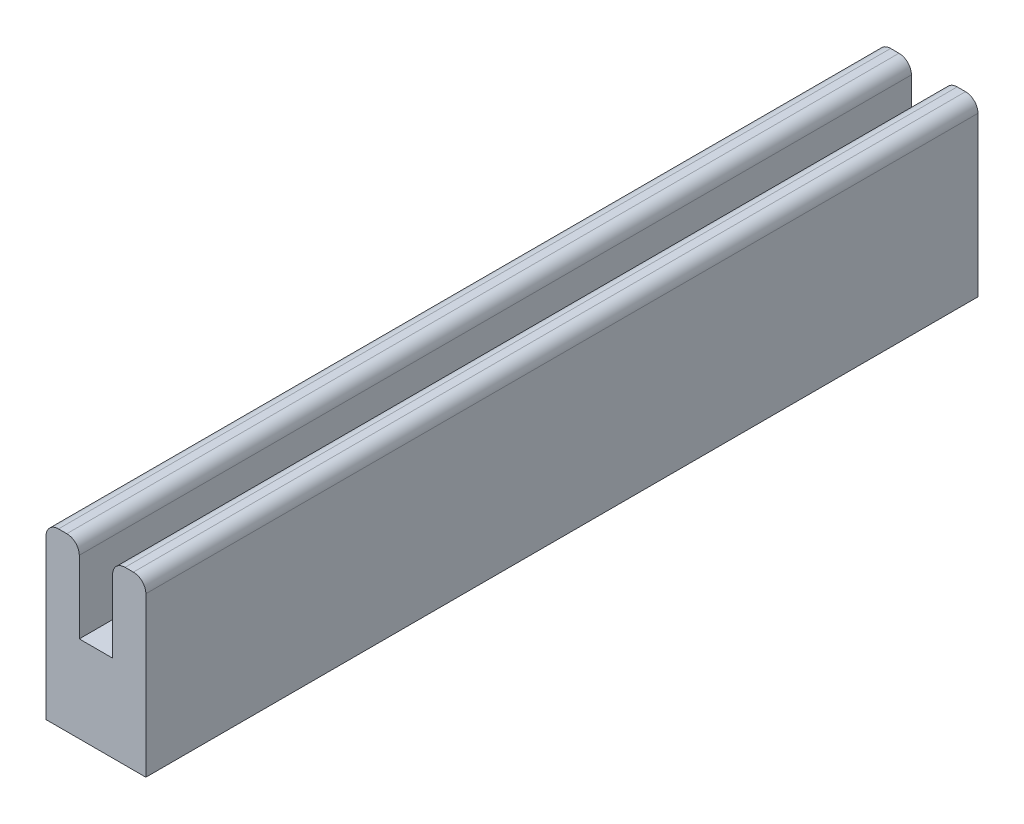
ISO-10303-21;
HEADER;
FILE_DESCRIPTION(('STEP AP214'),'2;1');
FILE_NAME('part.step','',(''),(''),'','','');
FILE_SCHEMA(('AUTOMOTIVE_DESIGN { 1 0 10303 214 1 1 1 1 }'));
ENDSEC;
DATA;
#1=APPLICATION_CONTEXT('core data for automotive mechanical design processes');
#2=APPLICATION_PROTOCOL_DEFINITION('international standard','automotive_design',2000,#1);
#3=PRODUCT_CONTEXT('',#1,'mechanical');
#4=PRODUCT('Part','Part','',(#3));
#5=PRODUCT_RELATED_PRODUCT_CATEGORY('part','',(#4));
#6=PRODUCT_DEFINITION_FORMATION('','',#4);
#7=PRODUCT_DEFINITION_CONTEXT('part definition',#1,'design');
#8=PRODUCT_DEFINITION('design','',#6,#7);
#9=PRODUCT_DEFINITION_SHAPE('','',#8);
#10=(LENGTH_UNIT() NAMED_UNIT(*) SI_UNIT(.MILLI.,.METRE.));
#11=(NAMED_UNIT(*) PLANE_ANGLE_UNIT() SI_UNIT($,.RADIAN.));
#12=(NAMED_UNIT(*) SI_UNIT($,.STERADIAN.) SOLID_ANGLE_UNIT());
#13=UNCERTAINTY_MEASURE_WITH_UNIT(LENGTH_MEASURE(1.E-05),#10,'distance_accuracy_value','');
#14=(GEOMETRIC_REPRESENTATION_CONTEXT(3) GLOBAL_UNCERTAINTY_ASSIGNED_CONTEXT((#13)) GLOBAL_UNIT_ASSIGNED_CONTEXT((#10,
#11,#12)) REPRESENTATION_CONTEXT('',''));
#15=CARTESIAN_POINT('',(0.,0.,0.));
#16=DIRECTION('',(0.,0.,1.));
#17=DIRECTION('',(1.,0.,0.));
#18=AXIS2_PLACEMENT_3D('',#15,#16,#17);
#19=CARTESIAN_POINT('',(-4.12068965517242,-5.2,50.));
#20=DIRECTION('',(1.,0.,0.));
#21=DIRECTION('',(0.,0.,-1.));
#22=AXIS2_PLACEMENT_3D('',#19,#20,#21);
#23=PLANE('',#22);
#24=DIRECTION('',(0.,-1.,0.));
#25=VECTOR('',#24,1.);
#26=CARTESIAN_POINT('',(-4.12068965517242,-3.2,36.4325982996987));
#27=LINE('',#26,#25);
#28=CARTESIAN_POINT('',(-4.12068965517242,-3.7,36.4325982996987));
#29=VERTEX_POINT('',#28);
#30=CARTESIAN_POINT('',(-4.12068965517242,-5.2,36.4325982996987));
#31=VERTEX_POINT('',#30);
#32=EDGE_CURVE('E214',#29,#31,#27,.T.);
#33=ORIENTED_EDGE('',*,*,#32,.F.);
#34=CARTESIAN_POINT('',(-4.12068965517242,-3.7,36.9325982996987));
#35=DIRECTION('',(1.,0.,0.));
#36=DIRECTION('',(0.,0.,-1.));
#37=AXIS2_PLACEMENT_3D('',#34,#35,#36);
#38=CIRCLE('',#37,0.5);
#39=CARTESIAN_POINT('',(-4.12068965517242,-3.2,36.9325982996987));
#40=VERTEX_POINT('',#39);
#41=EDGE_CURVE('E50',#29,#40,#38,.T.);
#42=ORIENTED_EDGE('',*,*,#41,.T.);
#43=DIRECTION('',(0.,0.,1.));
#44=VECTOR('',#43,1.);
#45=CARTESIAN_POINT('',(-4.12068965517242,-3.2,41.7447146813769));
#46=LINE('',#45,#44);
#47=CARTESIAN_POINT('',(-4.12068965517242,-3.2,41.2447146813769));
#48=VERTEX_POINT('',#47);
#49=EDGE_CURVE('E215',#40,#48,#46,.T.);
#50=ORIENTED_EDGE('',*,*,#49,.T.);
#51=CARTESIAN_POINT('',(-4.12068965517242,-3.7,41.2447146813769));
#52=DIRECTION('',(1.,0.,0.));
#53=DIRECTION('',(0.,0.,-1.));
#54=AXIS2_PLACEMENT_3D('',#51,#52,#53);
#55=CIRCLE('',#54,0.5);
#56=CARTESIAN_POINT('',(-4.12068965517242,-3.7,41.7447146813769));
#57=VERTEX_POINT('',#56);
#58=EDGE_CURVE('E11',#48,#57,#55,.T.);
#59=ORIENTED_EDGE('',*,*,#58,.T.);
#60=DIRECTION('',(0.,-1.,0.));
#61=VECTOR('',#60,1.);
#62=CARTESIAN_POINT('',(-4.12068965517242,-3.2,41.7447146813769));
#63=LINE('',#62,#61);
#64=CARTESIAN_POINT('',(-4.12068965517242,-5.2,41.7447146813769));
#65=VERTEX_POINT('',#64);
#66=EDGE_CURVE('E240',#57,#65,#63,.T.);
#67=ORIENTED_EDGE('',*,*,#66,.T.);
#68=DIRECTION('',(0.,0.,-1.));
#69=VECTOR('',#68,1.);
#70=CARTESIAN_POINT('',(-4.12068965517242,-5.2,50.));
#71=LINE('',#70,#69);
#72=CARTESIAN_POINT('',(-4.12068965517242,-5.2,50.));
#73=VERTEX_POINT('',#72);
#74=EDGE_CURVE('E307',#73,#65,#71,.T.);
#75=ORIENTED_EDGE('',*,*,#74,.F.);
#76=DIRECTION('',(0.,-1.,0.));
#77=VECTOR('',#76,1.);
#78=CARTESIAN_POINT('',(-4.12068965517242,-5.2,50.));
#79=LINE('',#78,#77);
#80=CARTESIAN_POINT('',(-4.12068965517242,4.35,50.));
#81=VERTEX_POINT('',#80);
#82=EDGE_CURVE('E257',#81,#73,#79,.T.);
#83=ORIENTED_EDGE('',*,*,#82,.F.);
#84=DIRECTION('',(0.,0.,-1.));
#85=VECTOR('',#84,1.);
#86=CARTESIAN_POINT('',(-4.12068965517242,4.35,50.));
#87=LINE('',#86,#85);
#88=CARTESIAN_POINT('',(-4.12068965517242,4.35,0.));
#89=VERTEX_POINT('',#88);
#90=EDGE_CURVE('E333',#81,#89,#87,.T.);
#91=ORIENTED_EDGE('',*,*,#90,.T.);
#92=DIRECTION('',(0.,-1.,0.));
#93=VECTOR('',#92,1.);
#94=CARTESIAN_POINT('',(-4.12068965517242,-5.2,0.));
#95=LINE('',#94,#93);
#96=CARTESIAN_POINT('',(-4.12068965517242,-5.2,0.));
#97=VERTEX_POINT('',#96);
#98=EDGE_CURVE('E256',#89,#97,#95,.T.);
#99=ORIENTED_EDGE('',*,*,#98,.T.);
#100=CARTESIAN_POINT('',(-4.12068965517242,-5.2,11.7889975203482));
#101=VERTEX_POINT('',#100);
#102=EDGE_CURVE('E306',#101,#97,#71,.T.);
#103=ORIENTED_EDGE('',*,*,#102,.F.);
#104=DIRECTION('',(0.,1.,0.));
#105=VECTOR('',#104,1.);
#106=CARTESIAN_POINT('',(-4.12068965517242,-5.2,11.7889975203482));
#107=LINE('',#106,#105);
#108=CARTESIAN_POINT('',(-4.12068965517242,-3.7,11.7889975203482));
#109=VERTEX_POINT('',#108);
#110=EDGE_CURVE('E239',#101,#109,#107,.T.);
#111=ORIENTED_EDGE('',*,*,#110,.T.);
#112=CARTESIAN_POINT('',(-4.12068965517242,-3.7,12.2889975203482));
#113=DIRECTION('',(1.,0.,0.));
#114=DIRECTION('',(0.,0.,-1.));
#115=AXIS2_PLACEMENT_3D('',#112,#113,#114);
#116=CIRCLE('',#115,0.5);
#117=CARTESIAN_POINT('',(-4.12068965517242,-3.2,12.2889975203482));
#118=VERTEX_POINT('',#117);
#119=EDGE_CURVE('E372',#109,#118,#116,.T.);
#120=ORIENTED_EDGE('',*,*,#119,.T.);
#121=DIRECTION('',(0.,0.,-1.));
#122=VECTOR('',#121,1.);
#123=CARTESIAN_POINT('',(-4.12068965517242,-3.2,50.));
#124=LINE('',#123,#122);
#125=CARTESIAN_POINT('',(-4.12068965517242,-3.2,16.6011139020263));
#126=VERTEX_POINT('',#125);
#127=EDGE_CURVE('E346',#126,#118,#124,.T.);
#128=ORIENTED_EDGE('',*,*,#127,.F.);
#129=CARTESIAN_POINT('',(-4.12068965517242,-3.7,16.6011139020263));
#130=DIRECTION('',(1.,0.,0.));
#131=DIRECTION('',(0.,0.,-1.));
#132=AXIS2_PLACEMENT_3D('',#129,#130,#131);
#133=CIRCLE('',#132,0.5);
#134=CARTESIAN_POINT('',(-4.12068965517242,-3.7,17.1011139020264));
#135=VERTEX_POINT('',#134);
#136=EDGE_CURVE('E374',#126,#135,#133,.T.);
#137=ORIENTED_EDGE('',*,*,#136,.T.);
#138=DIRECTION('',(0.,-1.,0.));
#139=VECTOR('',#138,1.);
#140=CARTESIAN_POINT('',(-4.12068965517242,-5.2,17.1011139020264));
#141=LINE('',#140,#139);
#142=CARTESIAN_POINT('',(-4.12068965517242,-5.2,17.1011139020264));
#143=VERTEX_POINT('',#142);
#144=EDGE_CURVE('E254',#135,#143,#141,.T.);
#145=ORIENTED_EDGE('',*,*,#144,.T.);
#146=EDGE_CURVE('E310',#31,#143,#71,.T.);
#147=ORIENTED_EDGE('',*,*,#146,.F.);
#148=EDGE_LOOP('',(#33,#42,#50,#59,#67,#75,#83,#91,#99,#103,#111,#120,#128,#137,#145,#147));
#149=FACE_BOUND('',#148,.T.);
#150=ADVANCED_FACE('F41',(#149),#23,.F.);
#151=CARTESIAN_POINT('',(1.87931034482758,-5.2,50.));
#152=DIRECTION('',(0.,1.,0.));
#153=DIRECTION('',(0.,0.,1.));
#154=AXIS2_PLACEMENT_3D('',#151,#152,#153);
#155=PLANE('',#154);
#156=ORIENTED_EDGE('',*,*,#146,.T.);
#157=DIRECTION('',(-1.,0.,0.));
#158=VECTOR('',#157,1.);
#159=CARTESIAN_POINT('',(-10.1000940605484,-5.2,17.1011139020264));
#160=LINE('',#159,#158);
#161=CARTESIAN_POINT('',(-10.1000940605484,-5.2,17.1011139020264));
#162=VERTEX_POINT('',#161);
#163=EDGE_CURVE('E245',#143,#162,#160,.T.);
#164=ORIENTED_EDGE('',*,*,#163,.T.);
#165=DIRECTION('',(0.,0.,-1.));
#166=VECTOR('',#165,1.);
#167=CARTESIAN_POINT('',(-10.1000940605484,-5.2,17.1011139020264));
#168=LINE('',#167,#166);
#169=CARTESIAN_POINT('',(-10.1000940605484,-5.2,11.7889975203482));
#170=VERTEX_POINT('',#169);
#171=EDGE_CURVE('E229',#162,#170,#168,.T.);
#172=ORIENTED_EDGE('',*,*,#171,.T.);
#173=DIRECTION('',(1.,0.,0.));
#174=VECTOR('',#173,1.);
#175=CARTESIAN_POINT('',(-10.1000940605484,-5.2,11.7889975203482));
#176=LINE('',#175,#174);
#177=EDGE_CURVE('E232',#170,#101,#176,.T.);
#178=ORIENTED_EDGE('',*,*,#177,.T.);
#179=ORIENTED_EDGE('',*,*,#102,.T.);
#180=DIRECTION('',(1.,0.,0.));
#181=VECTOR('',#180,1.);
#182=CARTESIAN_POINT('',(1.87931034482758,-5.2,0.));
#183=LINE('',#182,#181);
#184=CARTESIAN_POINT('',(1.87931034482758,-5.2,0.));
#185=VERTEX_POINT('',#184);
#186=EDGE_CURVE('E281',#97,#185,#183,.T.);
#187=ORIENTED_EDGE('',*,*,#186,.T.);
#188=DIRECTION('',(0.,0.,-1.));
#189=VECTOR('',#188,1.);
#190=CARTESIAN_POINT('',(1.87931034482758,-5.2,50.));
#191=LINE('',#190,#189);
#192=CARTESIAN_POINT('',(1.87931034482758,-5.2,50.));
#193=VERTEX_POINT('',#192);
#194=EDGE_CURVE('E303',#193,#185,#191,.T.);
#195=ORIENTED_EDGE('',*,*,#194,.F.);
#196=DIRECTION('',(1.,0.,0.));
#197=VECTOR('',#196,1.);
#198=CARTESIAN_POINT('',(1.87931034482758,-5.2,50.));
#199=LINE('',#198,#197);
#200=EDGE_CURVE('E259',#73,#193,#199,.T.);
#201=ORIENTED_EDGE('',*,*,#200,.F.);
#202=ORIENTED_EDGE('',*,*,#74,.T.);
#203=DIRECTION('',(-1.,0.,0.));
#204=VECTOR('',#203,1.);
#205=CARTESIAN_POINT('',(-10.1206896551724,-5.2,41.7447146813769));
#206=LINE('',#205,#204);
#207=CARTESIAN_POINT('',(-10.1206896551724,-5.2,41.7447146813769));
#208=VERTEX_POINT('',#207);
#209=EDGE_CURVE('E224',#65,#208,#206,.T.);
#210=ORIENTED_EDGE('',*,*,#209,.T.);
#211=DIRECTION('',(0.,0.,-1.));
#212=VECTOR('',#211,1.);
#213=CARTESIAN_POINT('',(-10.1206896551724,-5.2,41.7447146813769));
#214=LINE('',#213,#212);
#215=CARTESIAN_POINT('',(-10.1206896551724,-5.2,36.4325982996987));
#216=VERTEX_POINT('',#215);
#217=EDGE_CURVE('E207',#208,#216,#214,.T.);
#218=ORIENTED_EDGE('',*,*,#217,.T.);
#219=DIRECTION('',(1.,0.,0.));
#220=VECTOR('',#219,1.);
#221=CARTESIAN_POINT('',(-10.1206896551724,-5.2,36.4325982996987));
#222=LINE('',#221,#220);
#223=EDGE_CURVE('E218',#216,#31,#222,.T.);
#224=ORIENTED_EDGE('',*,*,#223,.T.);
#225=EDGE_LOOP('',(#156,#164,#172,#178,#179,#187,#195,#201,#202,#210,#218,#224));
#226=FACE_BOUND('',#225,.T.);
#227=ADVANCED_FACE('F226',(#226),#155,.F.);
#228=CARTESIAN_POINT('',(1.87931034482758,5.1,50.));
#229=DIRECTION('',(-1.,0.,0.));
#230=DIRECTION('',(0.,-1.,0.));
#231=AXIS2_PLACEMENT_3D('',#228,#229,#230);
#232=PLANE('',#231);
#233=DIRECTION('',(0.,1.,0.));
#234=VECTOR('',#233,1.);
#235=CARTESIAN_POINT('',(1.87931034482758,5.1,0.));
#236=LINE('',#235,#234);
#237=CARTESIAN_POINT('',(1.87931034482758,4.35,0.));
#238=VERTEX_POINT('',#237);
#239=EDGE_CURVE('E283',#185,#238,#236,.T.);
#240=ORIENTED_EDGE('',*,*,#239,.T.);
#241=DIRECTION('',(0.,0.,-1.));
#242=VECTOR('',#241,1.);
#243=CARTESIAN_POINT('',(1.87931034482758,4.35,50.));
#244=LINE('',#243,#242);
#245=CARTESIAN_POINT('',(1.87931034482758,4.35,50.));
#246=VERTEX_POINT('',#245);
#247=EDGE_CURVE('E323',#238,#246,#244,.F.);
#248=ORIENTED_EDGE('',*,*,#247,.T.);
#249=DIRECTION('',(0.,1.,0.));
#250=VECTOR('',#249,1.);
#251=CARTESIAN_POINT('',(1.87931034482758,5.1,50.));
#252=LINE('',#251,#250);
#253=EDGE_CURVE('E262',#193,#246,#252,.T.);
#254=ORIENTED_EDGE('',*,*,#253,.F.);
#255=ORIENTED_EDGE('',*,*,#194,.T.);
#256=EDGE_LOOP('',(#240,#248,#254,#255));
#257=FACE_BOUND('',#256,.T.);
#258=ADVANCED_FACE('F409',(#257),#232,.F.);
#259=CARTESIAN_POINT('',(-0.120689655172419,5.1,50.));
#260=DIRECTION('',(0.,-1.,0.));
#261=DIRECTION('',(0.,0.,-1.));
#262=AXIS2_PLACEMENT_3D('',#259,#260,#261);
#263=PLANE('',#262);
#264=DIRECTION('',(-1.,0.,0.));
#265=VECTOR('',#264,1.);
#266=CARTESIAN_POINT('',(-0.120689655172419,5.1,50.));
#267=LINE('',#266,#265);
#268=CARTESIAN_POINT('',(1.12931034482758,5.1,50.));
#269=VERTEX_POINT('',#268);
#270=CARTESIAN_POINT('',(0.629310344827581,5.1,50.));
#271=VERTEX_POINT('',#270);
#272=EDGE_CURVE('E265',#269,#271,#267,.T.);
#273=ORIENTED_EDGE('',*,*,#272,.F.);
#274=DIRECTION('',(0.,0.,-1.));
#275=VECTOR('',#274,1.);
#276=CARTESIAN_POINT('',(1.12931034482758,5.1,50.));
#277=LINE('',#276,#275);
#278=CARTESIAN_POINT('',(1.12931034482758,5.1,0.));
#279=VERTEX_POINT('',#278);
#280=EDGE_CURVE('E312',#269,#279,#277,.T.);
#281=ORIENTED_EDGE('',*,*,#280,.T.);
#282=DIRECTION('',(-1.,0.,0.));
#283=VECTOR('',#282,1.);
#284=CARTESIAN_POINT('',(-0.120689655172419,5.1,0.));
#285=LINE('',#284,#283);
#286=CARTESIAN_POINT('',(0.629310344827581,5.1,0.));
#287=VERTEX_POINT('',#286);
#288=EDGE_CURVE('E286',#279,#287,#285,.T.);
#289=ORIENTED_EDGE('',*,*,#288,.T.);
#290=DIRECTION('',(0.,0.,-1.));
#291=VECTOR('',#290,1.);
#292=CARTESIAN_POINT('',(0.629310344827581,5.1,50.));
#293=LINE('',#292,#291);
#294=EDGE_CURVE('E309',#287,#271,#293,.F.);
#295=ORIENTED_EDGE('',*,*,#294,.T.);
#296=EDGE_LOOP('',(#273,#281,#289,#295));
#297=FACE_BOUND('',#296,.T.);
#298=ADVANCED_FACE('F479',(#297),#263,.F.);
#299=CARTESIAN_POINT('',(-0.120689655172419,0.,50.));
#300=DIRECTION('',(1.,0.,0.));
#301=DIRECTION('',(0.,0.,-1.));
#302=AXIS2_PLACEMENT_3D('',#299,#300,#301);
#303=PLANE('',#302);
#304=DIRECTION('',(0.,-1.,0.));
#305=VECTOR('',#304,1.);
#306=CARTESIAN_POINT('',(-0.120689655172419,0.,50.));
#307=LINE('',#306,#305);
#308=CARTESIAN_POINT('',(-0.120689655172419,4.35,50.));
#309=VERTEX_POINT('',#308);
#310=CARTESIAN_POINT('',(-0.120689655172419,0.,50.));
#311=VERTEX_POINT('',#310);
#312=EDGE_CURVE('E268',#309,#311,#307,.T.);
#313=ORIENTED_EDGE('',*,*,#312,.F.);
#314=DIRECTION('',(0.,0.,-1.));
#315=VECTOR('',#314,1.);
#316=CARTESIAN_POINT('',(-0.120689655172419,4.35,50.));
#317=LINE('',#316,#315);
#318=CARTESIAN_POINT('',(-0.120689655172419,4.35,0.));
#319=VERTEX_POINT('',#318);
#320=EDGE_CURVE('E341',#309,#319,#317,.T.);
#321=ORIENTED_EDGE('',*,*,#320,.T.);
#322=DIRECTION('',(0.,-1.,0.));
#323=VECTOR('',#322,1.);
#324=CARTESIAN_POINT('',(-0.120689655172419,0.,0.));
#325=LINE('',#324,#323);
#326=CARTESIAN_POINT('',(-0.120689655172419,0.,0.));
#327=VERTEX_POINT('',#326);
#328=EDGE_CURVE('E289',#319,#327,#325,.T.);
#329=ORIENTED_EDGE('',*,*,#328,.T.);
#330=DIRECTION('',(0.,0.,-1.));
#331=VECTOR('',#330,1.);
#332=CARTESIAN_POINT('',(-0.120689655172419,0.,50.));
#333=LINE('',#332,#331);
#334=EDGE_CURVE('E300',#311,#327,#333,.T.);
#335=ORIENTED_EDGE('',*,*,#334,.F.);
#336=EDGE_LOOP('',(#313,#321,#329,#335));
#337=FACE_BOUND('',#336,.T.);
#338=ADVANCED_FACE('F485',(#337),#303,.F.);
#339=CARTESIAN_POINT('',(-2.12068965517242,0.,50.));
#340=DIRECTION('',(0.,-1.,0.));
#341=DIRECTION('',(0.,0.,-1.));
#342=AXIS2_PLACEMENT_3D('',#339,#340,#341);
#343=PLANE('',#342);
#344=DIRECTION('',(-1.,0.,0.));
#345=VECTOR('',#344,1.);
#346=CARTESIAN_POINT('',(-2.12068965517242,0.,0.));
#347=LINE('',#346,#345);
#348=CARTESIAN_POINT('',(-2.12068965517242,0.,0.));
#349=VERTEX_POINT('',#348);
#350=EDGE_CURVE('E291',#327,#349,#347,.T.);
#351=ORIENTED_EDGE('',*,*,#350,.T.);
#352=DIRECTION('',(0.,0.,-1.));
#353=VECTOR('',#352,1.);
#354=CARTESIAN_POINT('',(-2.12068965517242,0.,50.));
#355=LINE('',#354,#353);
#356=CARTESIAN_POINT('',(-2.12068965517242,0.,50.));
#357=VERTEX_POINT('',#356);
#358=EDGE_CURVE('E278',#357,#349,#355,.T.);
#359=ORIENTED_EDGE('',*,*,#358,.F.);
#360=DIRECTION('',(-1.,0.,0.));
#361=VECTOR('',#360,1.);
#362=CARTESIAN_POINT('',(-2.12068965517242,0.,50.));
#363=LINE('',#362,#361);
#364=EDGE_CURVE('E270',#311,#357,#363,.T.);
#365=ORIENTED_EDGE('',*,*,#364,.F.);
#366=ORIENTED_EDGE('',*,*,#334,.T.);
#367=EDGE_LOOP('',(#351,#359,#365,#366));
#368=FACE_BOUND('',#367,.T.);
#369=ADVANCED_FACE('F491',(#368),#343,.F.);
#370=CARTESIAN_POINT('',(-2.12068965517242,5.1,50.));
#371=DIRECTION('',(-1.,0.,0.));
#372=DIRECTION('',(0.,-1.,0.));
#373=AXIS2_PLACEMENT_3D('',#370,#371,#372);
#374=PLANE('',#373);
#375=DIRECTION('',(0.,1.,0.));
#376=VECTOR('',#375,1.);
#377=CARTESIAN_POINT('',(-2.12068965517242,5.1,0.));
#378=LINE('',#377,#376);
#379=CARTESIAN_POINT('',(-2.12068965517242,4.35,0.));
#380=VERTEX_POINT('',#379);
#381=EDGE_CURVE('E293',#349,#380,#378,.T.);
#382=ORIENTED_EDGE('',*,*,#381,.T.);
#383=DIRECTION('',(0.,0.,-1.));
#384=VECTOR('',#383,1.);
#385=CARTESIAN_POINT('',(-2.12068965517242,4.35,50.));
#386=LINE('',#385,#384);
#387=CARTESIAN_POINT('',(-2.12068965517242,4.35,50.));
#388=VERTEX_POINT('',#387);
#389=EDGE_CURVE('E344',#380,#388,#386,.F.);
#390=ORIENTED_EDGE('',*,*,#389,.T.);
#391=DIRECTION('',(0.,1.,0.));
#392=VECTOR('',#391,1.);
#393=CARTESIAN_POINT('',(-2.12068965517242,5.1,50.));
#394=LINE('',#393,#392);
#395=EDGE_CURVE('E272',#357,#388,#394,.T.);
#396=ORIENTED_EDGE('',*,*,#395,.F.);
#397=ORIENTED_EDGE('',*,*,#358,.T.);
#398=EDGE_LOOP('',(#382,#390,#396,#397));
#399=FACE_BOUND('',#398,.T.);
#400=ADVANCED_FACE('F531',(#399),#374,.F.);
#401=CARTESIAN_POINT('',(-4.12068965517242,5.1,50.));
#402=DIRECTION('',(0.,-1.,0.));
#403=DIRECTION('',(1.,0.,0.));
#404=AXIS2_PLACEMENT_3D('',#401,#402,#403);
#405=PLANE('',#404);
#406=DIRECTION('',(-1.,0.,0.));
#407=VECTOR('',#406,1.);
#408=CARTESIAN_POINT('',(-4.12068965517242,5.1,0.));
#409=LINE('',#408,#407);
#410=CARTESIAN_POINT('',(-2.87068965517242,5.1,0.));
#411=VERTEX_POINT('',#410);
#412=CARTESIAN_POINT('',(-3.37068965517242,5.1,0.));
#413=VERTEX_POINT('',#412);
#414=EDGE_CURVE('E260',#411,#413,#409,.T.);
#415=ORIENTED_EDGE('',*,*,#414,.T.);
#416=DIRECTION('',(0.,0.,-1.));
#417=VECTOR('',#416,1.);
#418=CARTESIAN_POINT('',(-3.37068965517242,5.1,50.));
#419=LINE('',#418,#417);
#420=CARTESIAN_POINT('',(-3.37068965517242,5.1,50.));
#421=VERTEX_POINT('',#420);
#422=EDGE_CURVE('E339',#413,#421,#419,.F.);
#423=ORIENTED_EDGE('',*,*,#422,.T.);
#424=DIRECTION('',(-1.,0.,0.));
#425=VECTOR('',#424,1.);
#426=CARTESIAN_POINT('',(-4.12068965517242,5.1,50.));
#427=LINE('',#426,#425);
#428=CARTESIAN_POINT('',(-2.87068965517242,5.1,50.));
#429=VERTEX_POINT('',#428);
#430=EDGE_CURVE('E275',#429,#421,#427,.T.);
#431=ORIENTED_EDGE('',*,*,#430,.F.);
#432=DIRECTION('',(0.,0.,-1.));
#433=VECTOR('',#432,1.);
#434=CARTESIAN_POINT('',(-2.87068965517242,5.1,50.));
#435=LINE('',#434,#433);
#436=EDGE_CURVE('E336',#429,#411,#435,.T.);
#437=ORIENTED_EDGE('',*,*,#436,.T.);
#438=EDGE_LOOP('',(#415,#423,#431,#437));
#439=FACE_BOUND('',#438,.T.);
#440=ADVANCED_FACE('F500',(#439),#405,.F.);
#441=CARTESIAN_POINT('',(0.,0.,50.));
#442=DIRECTION('',(0.,0.,-1.));
#443=DIRECTION('',(-1.,0.,0.));
#444=AXIS2_PLACEMENT_3D('',#441,#442,#443);
#445=PLANE('',#444);
#446=ORIENTED_EDGE('',*,*,#253,.T.);
#447=CARTESIAN_POINT('',(1.12931034482758,4.35,50.));
#448=DIRECTION('',(0.,0.,-1.));
#449=DIRECTION('',(-1.,0.,0.));
#450=AXIS2_PLACEMENT_3D('',#447,#448,#449);
#451=CIRCLE('',#450,0.75);
#452=EDGE_CURVE('E331',#246,#269,#451,.F.);
#453=ORIENTED_EDGE('',*,*,#452,.T.);
#454=ORIENTED_EDGE('',*,*,#272,.T.);
#455=CARTESIAN_POINT('',(0.629310344827581,4.35,50.));
#456=DIRECTION('',(0.,0.,-1.));
#457=DIRECTION('',(-1.,0.,0.));
#458=AXIS2_PLACEMENT_3D('',#455,#456,#457);
#459=CIRCLE('',#458,0.75);
#460=EDGE_CURVE('E327',#271,#309,#459,.F.);
#461=ORIENTED_EDGE('',*,*,#460,.T.);
#462=ORIENTED_EDGE('',*,*,#312,.T.);
#463=ORIENTED_EDGE('',*,*,#364,.T.);
#464=ORIENTED_EDGE('',*,*,#395,.T.);
#465=CARTESIAN_POINT('',(-2.87068965517242,4.35,50.));
#466=DIRECTION('',(0.,0.,-1.));
#467=DIRECTION('',(-1.,0.,0.));
#468=AXIS2_PLACEMENT_3D('',#465,#466,#467);
#469=CIRCLE('',#468,0.75);
#470=EDGE_CURVE('E325',#388,#429,#469,.F.);
#471=ORIENTED_EDGE('',*,*,#470,.T.);
#472=ORIENTED_EDGE('',*,*,#430,.T.);
#473=CARTESIAN_POINT('',(-3.37068965517242,4.35,50.));
#474=DIRECTION('',(0.,0.,-1.));
#475=DIRECTION('',(-1.,0.,0.));
#476=AXIS2_PLACEMENT_3D('',#473,#474,#475);
#477=CIRCLE('',#476,0.75);
#478=EDGE_CURVE('E329',#421,#81,#477,.F.);
#479=ORIENTED_EDGE('',*,*,#478,.T.);
#480=ORIENTED_EDGE('',*,*,#82,.T.);
#481=ORIENTED_EDGE('',*,*,#200,.T.);
#482=EDGE_LOOP('',(#446,#453,#454,#461,#462,#463,#464,#471,#472,#479,#480,#481));
#483=FACE_BOUND('',#482,.T.);
#484=ADVANCED_FACE('F476',(#483),#445,.F.);
#485=CARTESIAN_POINT('',(0.,0.,0.));
#486=DIRECTION('',(0.,0.,-1.));
#487=DIRECTION('',(-1.,0.,0.));
#488=AXIS2_PLACEMENT_3D('',#485,#486,#487);
#489=PLANE('',#488);
#490=ORIENTED_EDGE('',*,*,#288,.F.);
#491=CARTESIAN_POINT('',(1.12931034482758,4.35,0.));
#492=DIRECTION('',(0.,0.,-1.));
#493=DIRECTION('',(-1.,0.,0.));
#494=AXIS2_PLACEMENT_3D('',#491,#492,#493);
#495=CIRCLE('',#494,0.75);
#496=EDGE_CURVE('E321',#279,#238,#495,.T.);
#497=ORIENTED_EDGE('',*,*,#496,.T.);
#498=ORIENTED_EDGE('',*,*,#239,.F.);
#499=ORIENTED_EDGE('',*,*,#186,.F.);
#500=ORIENTED_EDGE('',*,*,#98,.F.);
#501=CARTESIAN_POINT('',(-3.37068965517242,4.35,0.));
#502=DIRECTION('',(0.,0.,-1.));
#503=DIRECTION('',(-1.,0.,0.));
#504=AXIS2_PLACEMENT_3D('',#501,#502,#503);
#505=CIRCLE('',#504,0.75);
#506=EDGE_CURVE('E319',#89,#413,#505,.T.);
#507=ORIENTED_EDGE('',*,*,#506,.T.);
#508=ORIENTED_EDGE('',*,*,#414,.F.);
#509=CARTESIAN_POINT('',(-2.87068965517242,4.35,0.));
#510=DIRECTION('',(0.,0.,-1.));
#511=DIRECTION('',(-1.,0.,0.));
#512=AXIS2_PLACEMENT_3D('',#509,#510,#511);
#513=CIRCLE('',#512,0.75);
#514=EDGE_CURVE('E315',#411,#380,#513,.T.);
#515=ORIENTED_EDGE('',*,*,#514,.T.);
#516=ORIENTED_EDGE('',*,*,#381,.F.);
#517=ORIENTED_EDGE('',*,*,#350,.F.);
#518=ORIENTED_EDGE('',*,*,#328,.F.);
#519=CARTESIAN_POINT('',(0.629310344827581,4.35,0.));
#520=DIRECTION('',(0.,0.,-1.));
#521=DIRECTION('',(-1.,0.,0.));
#522=AXIS2_PLACEMENT_3D('',#519,#520,#521);
#523=CIRCLE('',#522,0.75);
#524=EDGE_CURVE('E317',#319,#287,#523,.T.);
#525=ORIENTED_EDGE('',*,*,#524,.T.);
#526=EDGE_LOOP('',(#490,#497,#498,#499,#500,#507,#508,#515,#516,#517,#518,#525));
#527=FACE_BOUND('',#526,.T.);
#528=ADVANCED_FACE('F417',(#527),#489,.T.);
#529=CARTESIAN_POINT('',(1.12931034482758,4.35,50.));
#530=DIRECTION('',(0.,0.,-1.));
#531=DIRECTION('',(-1.,0.,0.));
#532=AXIS2_PLACEMENT_3D('',#529,#530,#531);
#533=CYLINDRICAL_SURFACE('',#532,0.75);
#534=ORIENTED_EDGE('',*,*,#452,.F.);
#535=ORIENTED_EDGE('',*,*,#247,.F.);
#536=ORIENTED_EDGE('',*,*,#496,.F.);
#537=ORIENTED_EDGE('',*,*,#280,.F.);
#538=EDGE_LOOP('',(#534,#535,#536,#537));
#539=FACE_BOUND('',#538,.T.);
#540=ADVANCED_FACE('F413',(#539),#533,.T.);
#541=CARTESIAN_POINT('',(-3.37068965517242,4.35,50.));
#542=DIRECTION('',(0.,0.,-1.));
#543=DIRECTION('',(-1.,0.,0.));
#544=AXIS2_PLACEMENT_3D('',#541,#542,#543);
#545=CYLINDRICAL_SURFACE('',#544,0.75);
#546=ORIENTED_EDGE('',*,*,#478,.F.);
#547=ORIENTED_EDGE('',*,*,#422,.F.);
#548=ORIENTED_EDGE('',*,*,#506,.F.);
#549=ORIENTED_EDGE('',*,*,#90,.F.);
#550=EDGE_LOOP('',(#546,#547,#548,#549));
#551=FACE_BOUND('',#550,.T.);
#552=ADVANCED_FACE('F416',(#551),#545,.T.);
#553=CARTESIAN_POINT('',(0.629310344827581,4.35,50.));
#554=DIRECTION('',(0.,0.,-1.));
#555=DIRECTION('',(-1.,0.,0.));
#556=AXIS2_PLACEMENT_3D('',#553,#554,#555);
#557=CYLINDRICAL_SURFACE('',#556,0.75);
#558=ORIENTED_EDGE('',*,*,#460,.F.);
#559=ORIENTED_EDGE('',*,*,#294,.F.);
#560=ORIENTED_EDGE('',*,*,#524,.F.);
#561=ORIENTED_EDGE('',*,*,#320,.F.);
#562=EDGE_LOOP('',(#558,#559,#560,#561));
#563=FACE_BOUND('',#562,.T.);
#564=ADVANCED_FACE('F421',(#563),#557,.T.);
#565=CARTESIAN_POINT('',(-2.87068965517242,4.35,50.));
#566=DIRECTION('',(0.,0.,-1.));
#567=DIRECTION('',(-1.,0.,0.));
#568=AXIS2_PLACEMENT_3D('',#565,#566,#567);
#569=CYLINDRICAL_SURFACE('',#568,0.75);
#570=ORIENTED_EDGE('',*,*,#470,.F.);
#571=ORIENTED_EDGE('',*,*,#389,.F.);
#572=ORIENTED_EDGE('',*,*,#514,.F.);
#573=ORIENTED_EDGE('',*,*,#436,.F.);
#574=EDGE_LOOP('',(#570,#571,#572,#573));
#575=FACE_BOUND('',#574,.T.);
#576=ADVANCED_FACE('F425',(#575),#569,.T.);
#577=CARTESIAN_POINT('',(-10.1206896551724,-3.2,41.7447146813769));
#578=DIRECTION('',(-1.,0.,0.));
#579=DIRECTION('',(0.,0.,1.));
#580=AXIS2_PLACEMENT_3D('',#577,#578,#579);
#581=PLANE('',#580);
#582=DIRECTION('',(0.,-1.,0.));
#583=VECTOR('',#582,1.);
#584=CARTESIAN_POINT('',(-10.1206896551724,-3.2,41.7447146813769));
#585=LINE('',#584,#583);
#586=CARTESIAN_POINT('',(-10.1206896551724,-3.7,41.7447146813769));
#587=VERTEX_POINT('',#586);
#588=EDGE_CURVE('E237',#587,#208,#585,.T.);
#589=ORIENTED_EDGE('',*,*,#588,.F.);
#590=DIRECTION('',(0.,0.,-1.));
#591=VECTOR('',#590,1.);
#592=CARTESIAN_POINT('',(-10.1206896551724,-3.7,36.4325982996987));
#593=LINE('',#592,#591);
#594=CARTESIAN_POINT('',(-10.1206896551724,-3.7,36.4325982996987));
#595=VERTEX_POINT('',#594);
#596=EDGE_CURVE('E210',#587,#595,#593,.T.);
#597=ORIENTED_EDGE('',*,*,#596,.T.);
#598=DIRECTION('',(0.,-1.,0.));
#599=VECTOR('',#598,1.);
#600=CARTESIAN_POINT('',(-10.1206896551724,-3.2,36.4325982996987));
#601=LINE('',#600,#599);
#602=EDGE_CURVE('E203',#595,#216,#601,.T.);
#603=ORIENTED_EDGE('',*,*,#602,.T.);
#604=ORIENTED_EDGE('',*,*,#217,.F.);
#605=EDGE_LOOP('',(#589,#597,#603,#604));
#606=FACE_BOUND('',#605,.T.);
#607=ADVANCED_FACE('F205',(#606),#581,.T.);
#608=CARTESIAN_POINT('',(-10.1206896551724,-3.2,41.7447146813769));
#609=DIRECTION('',(0.,0.,1.));
#610=DIRECTION('',(1.,0.,0.));
#611=AXIS2_PLACEMENT_3D('',#608,#609,#610);
#612=PLANE('',#611);
#613=ORIENTED_EDGE('',*,*,#66,.F.);
#614=DIRECTION('',(-1.,0.,0.));
#615=VECTOR('',#614,1.);
#616=CARTESIAN_POINT('',(-10.1206896551724,-3.7,41.7447146813769));
#617=LINE('',#616,#615);
#618=EDGE_CURVE('E58',#57,#587,#617,.T.);
#619=ORIENTED_EDGE('',*,*,#618,.T.);
#620=ORIENTED_EDGE('',*,*,#588,.T.);
#621=ORIENTED_EDGE('',*,*,#209,.F.);
#622=EDGE_LOOP('',(#613,#619,#620,#621));
#623=FACE_BOUND('',#622,.T.);
#624=ADVANCED_FACE('F506',(#623),#612,.T.);
#625=CARTESIAN_POINT('',(-10.1206896551724,-3.2,36.4325982996987));
#626=DIRECTION('',(0.,0.,-1.));
#627=DIRECTION('',(-1.,0.,0.));
#628=AXIS2_PLACEMENT_3D('',#625,#626,#627);
#629=PLANE('',#628);
#630=ORIENTED_EDGE('',*,*,#602,.F.);
#631=DIRECTION('',(1.,0.,0.));
#632=VECTOR('',#631,1.);
#633=CARTESIAN_POINT('',(-4.12068965517242,-3.7,36.4325982996987));
#634=LINE('',#633,#632);
#635=EDGE_CURVE('E362',#595,#29,#634,.T.);
#636=ORIENTED_EDGE('',*,*,#635,.T.);
#637=ORIENTED_EDGE('',*,*,#32,.T.);
#638=ORIENTED_EDGE('',*,*,#223,.F.);
#639=EDGE_LOOP('',(#630,#636,#637,#638));
#640=FACE_BOUND('',#639,.T.);
#641=ADVANCED_FACE('F219',(#640),#629,.T.);
#642=CARTESIAN_POINT('',(0.,-3.2,0.));
#643=DIRECTION('',(0.,-1.,0.));
#644=DIRECTION('',(0.,0.,-1.));
#645=AXIS2_PLACEMENT_3D('',#642,#643,#644);
#646=PLANE('',#645);
#647=ORIENTED_EDGE('',*,*,#49,.F.);
#648=DIRECTION('',(1.,0.,0.));
#649=VECTOR('',#648,1.);
#650=CARTESIAN_POINT('',(-10.1206896551724,-3.2,36.9325982996987));
#651=LINE('',#650,#649);
#652=CARTESIAN_POINT('',(-9.62068965517242,-3.2,36.9325982996987));
#653=VERTEX_POINT('',#652);
#654=EDGE_CURVE('E368',#40,#653,#651,.F.);
#655=ORIENTED_EDGE('',*,*,#654,.T.);
#656=DIRECTION('',(0.,0.,-1.));
#657=VECTOR('',#656,1.);
#658=CARTESIAN_POINT('',(-9.62068965517242,-3.2,41.7447146813769));
#659=LINE('',#658,#657);
#660=CARTESIAN_POINT('',(-9.62068965517242,-3.2,41.2447146813769));
#661=VERTEX_POINT('',#660);
#662=EDGE_CURVE('E364',#653,#661,#659,.F.);
#663=ORIENTED_EDGE('',*,*,#662,.T.);
#664=DIRECTION('',(-1.,0.,0.));
#665=VECTOR('',#664,1.);
#666=CARTESIAN_POINT('',(-4.12068965517242,-3.2,41.2447146813769));
#667=LINE('',#666,#665);
#668=EDGE_CURVE('E366',#661,#48,#667,.F.);
#669=ORIENTED_EDGE('',*,*,#668,.T.);
#670=EDGE_LOOP('',(#647,#655,#663,#669));
#671=FACE_BOUND('',#670,.T.);
#672=ADVANCED_FACE('F395',(#671),#646,.F.);
#673=CARTESIAN_POINT('',(0.,-3.2,0.));
#674=DIRECTION('',(0.,-1.,0.));
#675=DIRECTION('',(0.,0.,-1.));
#676=AXIS2_PLACEMENT_3D('',#673,#674,#675);
#677=PLANE('',#676);
#678=ORIENTED_EDGE('',*,*,#127,.T.);
#679=DIRECTION('',(1.,0.,0.));
#680=VECTOR('',#679,1.);
#681=CARTESIAN_POINT('',(-10.1000940605484,-3.2,12.2889975203482));
#682=LINE('',#681,#680);
#683=CARTESIAN_POINT('',(-9.60009406054843,-3.2,12.2889975203482));
#684=VERTEX_POINT('',#683);
#685=EDGE_CURVE('E356',#118,#684,#682,.F.);
#686=ORIENTED_EDGE('',*,*,#685,.T.);
#687=DIRECTION('',(0.,0.,-1.));
#688=VECTOR('',#687,1.);
#689=CARTESIAN_POINT('',(-9.60009406054843,-3.2,17.1011139020264));
#690=LINE('',#689,#688);
#691=CARTESIAN_POINT('',(-9.60009406054843,-3.2,16.6011139020263));
#692=VERTEX_POINT('',#691);
#693=EDGE_CURVE('E352',#684,#692,#690,.F.);
#694=ORIENTED_EDGE('',*,*,#693,.T.);
#695=DIRECTION('',(-1.,0.,0.));
#696=VECTOR('',#695,1.);
#697=CARTESIAN_POINT('',(-4.12068965517242,-3.2,16.6011139020263));
#698=LINE('',#697,#696);
#699=EDGE_CURVE('E354',#692,#126,#698,.F.);
#700=ORIENTED_EDGE('',*,*,#699,.T.);
#701=EDGE_LOOP('',(#678,#686,#694,#700));
#702=FACE_BOUND('',#701,.T.);
#703=ADVANCED_FACE('F521',(#702),#677,.F.);
#704=CARTESIAN_POINT('',(-10.1000940605484,-3.2,17.1011139020264));
#705=DIRECTION('',(0.,0.,1.));
#706=DIRECTION('',(1.,0.,0.));
#707=AXIS2_PLACEMENT_3D('',#704,#705,#706);
#708=PLANE('',#707);
#709=ORIENTED_EDGE('',*,*,#144,.F.);
#710=DIRECTION('',(-1.,0.,0.));
#711=VECTOR('',#710,1.);
#712=CARTESIAN_POINT('',(-10.1000940605484,-3.7,17.1011139020264));
#713=LINE('',#712,#711);
#714=CARTESIAN_POINT('',(-10.1000940605484,-3.7,17.1011139020264));
#715=VERTEX_POINT('',#714);
#716=EDGE_CURVE('E358',#135,#715,#713,.T.);
#717=ORIENTED_EDGE('',*,*,#716,.T.);
#718=DIRECTION('',(0.,-1.,0.));
#719=VECTOR('',#718,1.);
#720=CARTESIAN_POINT('',(-10.1000940605484,-3.2,17.1011139020264));
#721=LINE('',#720,#719);
#722=EDGE_CURVE('E246',#715,#162,#721,.T.);
#723=ORIENTED_EDGE('',*,*,#722,.T.);
#724=ORIENTED_EDGE('',*,*,#163,.F.);
#725=EDGE_LOOP('',(#709,#717,#723,#724));
#726=FACE_BOUND('',#725,.T.);
#727=ADVANCED_FACE('F455',(#726),#708,.T.);
#728=CARTESIAN_POINT('',(-10.1000940605484,-3.2,11.7889975203482));
#729=DIRECTION('',(0.,0.,-1.));
#730=DIRECTION('',(-1.,0.,0.));
#731=AXIS2_PLACEMENT_3D('',#728,#729,#730);
#732=PLANE('',#731);
#733=DIRECTION('',(0.,-1.,0.));
#734=VECTOR('',#733,1.);
#735=CARTESIAN_POINT('',(-10.1000940605484,-3.2,11.7889975203482));
#736=LINE('',#735,#734);
#737=CARTESIAN_POINT('',(-10.1000940605484,-3.7,11.7889975203482));
#738=VERTEX_POINT('',#737);
#739=EDGE_CURVE('E243',#738,#170,#736,.T.);
#740=ORIENTED_EDGE('',*,*,#739,.F.);
#741=DIRECTION('',(1.,0.,0.));
#742=VECTOR('',#741,1.);
#743=CARTESIAN_POINT('',(-4.12068965517242,-3.7,11.7889975203482));
#744=LINE('',#743,#742);
#745=EDGE_CURVE('E349',#738,#109,#744,.T.);
#746=ORIENTED_EDGE('',*,*,#745,.T.);
#747=ORIENTED_EDGE('',*,*,#110,.F.);
#748=ORIENTED_EDGE('',*,*,#177,.F.);
#749=EDGE_LOOP('',(#740,#746,#747,#748));
#750=FACE_BOUND('',#749,.T.);
#751=ADVANCED_FACE('F444',(#750),#732,.T.);
#752=CARTESIAN_POINT('',(-10.1000940605484,-3.2,17.1011139020264));
#753=DIRECTION('',(-1.,0.,0.));
#754=DIRECTION('',(0.,0.,1.));
#755=AXIS2_PLACEMENT_3D('',#752,#753,#754);
#756=PLANE('',#755);
#757=ORIENTED_EDGE('',*,*,#722,.F.);
#758=DIRECTION('',(0.,0.,-1.));
#759=VECTOR('',#758,1.);
#760=CARTESIAN_POINT('',(-10.1000940605484,-3.7,11.7889975203482));
#761=LINE('',#760,#759);
#762=EDGE_CURVE('E360',#715,#738,#761,.T.);
#763=ORIENTED_EDGE('',*,*,#762,.T.);
#764=ORIENTED_EDGE('',*,*,#739,.T.);
#765=ORIENTED_EDGE('',*,*,#171,.F.);
#766=EDGE_LOOP('',(#757,#763,#764,#765));
#767=FACE_BOUND('',#766,.T.);
#768=ADVANCED_FACE('F439',(#767),#756,.T.);
#769=CARTESIAN_POINT('',(-10.1000940605484,-3.7,16.6011139020263));
#770=DIRECTION('',(1.,0.,0.));
#771=DIRECTION('',(0.,0.,-1.));
#772=AXIS2_PLACEMENT_3D('',#769,#770,#771);
#773=CYLINDRICAL_SURFACE('',#772,0.5);
#774=ORIENTED_EDGE('',*,*,#136,.F.);
#775=ORIENTED_EDGE('',*,*,#699,.F.);
#776=CARTESIAN_POINT('',(-9.60009406054843,-3.7,16.6011139020263));
#777=DIRECTION('',(0.707106781186547,0.,0.707106781186547));
#778=DIRECTION('',(-0.707106781186547,0.,0.707106781186547));
#779=AXIS2_PLACEMENT_3D('',#776,#777,#778);
#780=ELLIPSE('',#779,0.707106781186547,0.5);
#781=EDGE_CURVE('E248',#715,#692,#780,.F.);
#782=ORIENTED_EDGE('',*,*,#781,.F.);
#783=ORIENTED_EDGE('',*,*,#716,.F.);
#784=EDGE_LOOP('',(#774,#775,#782,#783));
#785=FACE_BOUND('',#784,.T.);
#786=ADVANCED_FACE('F436',(#785),#773,.T.);
#787=CARTESIAN_POINT('',(-9.60009406054843,-3.7,17.1011139020264));
#788=DIRECTION('',(0.,0.,1.));
#789=DIRECTION('',(1.,0.,0.));
#790=AXIS2_PLACEMENT_3D('',#787,#788,#789);
#791=CYLINDRICAL_SURFACE('',#790,0.5);
#792=ORIENTED_EDGE('',*,*,#781,.T.);
#793=ORIENTED_EDGE('',*,*,#693,.F.);
#794=CARTESIAN_POINT('',(-9.60009406054843,-3.7,12.2889975203482));
#795=DIRECTION('',(-0.707106781186547,0.,0.707106781186547));
#796=DIRECTION('',(0.707106781186547,0.,0.707106781186547));
#797=AXIS2_PLACEMENT_3D('',#794,#795,#796);
#798=ELLIPSE('',#797,0.707106781186547,0.5);
#799=EDGE_CURVE('E377',#738,#684,#798,.F.);
#800=ORIENTED_EDGE('',*,*,#799,.F.);
#801=ORIENTED_EDGE('',*,*,#762,.F.);
#802=EDGE_LOOP('',(#792,#793,#800,#801));
#803=FACE_BOUND('',#802,.T.);
#804=ADVANCED_FACE('F433',(#803),#791,.T.);
#805=CARTESIAN_POINT('',(-10.1000940605484,-3.7,12.2889975203482));
#806=DIRECTION('',(-1.,0.,0.));
#807=DIRECTION('',(0.,0.,1.));
#808=AXIS2_PLACEMENT_3D('',#805,#806,#807);
#809=CYLINDRICAL_SURFACE('',#808,0.5);
#810=ORIENTED_EDGE('',*,*,#799,.T.);
#811=ORIENTED_EDGE('',*,*,#685,.F.);
#812=ORIENTED_EDGE('',*,*,#119,.F.);
#813=ORIENTED_EDGE('',*,*,#745,.F.);
#814=EDGE_LOOP('',(#810,#811,#812,#813));
#815=FACE_BOUND('',#814,.T.);
#816=ADVANCED_FACE('F430',(#815),#809,.T.);
#817=CARTESIAN_POINT('',(-10.1206896551724,-3.7,41.2447146813769));
#818=DIRECTION('',(1.,0.,0.));
#819=DIRECTION('',(0.,0.,-1.));
#820=AXIS2_PLACEMENT_3D('',#817,#818,#819);
#821=CYLINDRICAL_SURFACE('',#820,0.5);
#822=ORIENTED_EDGE('',*,*,#58,.F.);
#823=ORIENTED_EDGE('',*,*,#668,.F.);
#824=CARTESIAN_POINT('',(-9.62068965517242,-3.7,41.2447146813769));
#825=DIRECTION('',(0.707106781186547,0.,0.707106781186547));
#826=DIRECTION('',(-0.707106781186547,0.,0.707106781186547));
#827=AXIS2_PLACEMENT_3D('',#824,#825,#826);
#828=ELLIPSE('',#827,0.707106781186547,0.5);
#829=EDGE_CURVE('E45',#587,#661,#828,.F.);
#830=ORIENTED_EDGE('',*,*,#829,.F.);
#831=ORIENTED_EDGE('',*,*,#618,.F.);
#832=EDGE_LOOP('',(#822,#823,#830,#831));
#833=FACE_BOUND('',#832,.T.);
#834=ADVANCED_FACE('F43',(#833),#821,.T.);
#835=CARTESIAN_POINT('',(-9.62068965517242,-3.7,41.7447146813769));
#836=DIRECTION('',(0.,0.,1.));
#837=DIRECTION('',(1.,0.,0.));
#838=AXIS2_PLACEMENT_3D('',#835,#836,#837);
#839=CYLINDRICAL_SURFACE('',#838,0.5);
#840=ORIENTED_EDGE('',*,*,#829,.T.);
#841=ORIENTED_EDGE('',*,*,#662,.F.);
#842=CARTESIAN_POINT('',(-9.62068965517242,-3.7,36.9325982996987));
#843=DIRECTION('',(-0.707106781186547,0.,0.707106781186547));
#844=DIRECTION('',(0.707106781186547,0.,0.707106781186547));
#845=AXIS2_PLACEMENT_3D('',#842,#843,#844);
#846=ELLIPSE('',#845,0.707106781186547,0.5);
#847=EDGE_CURVE('E381',#595,#653,#846,.F.);
#848=ORIENTED_EDGE('',*,*,#847,.F.);
#849=ORIENTED_EDGE('',*,*,#596,.F.);
#850=EDGE_LOOP('',(#840,#841,#848,#849));
#851=FACE_BOUND('',#850,.T.);
#852=ADVANCED_FACE('F390',(#851),#839,.T.);
#853=CARTESIAN_POINT('',(-10.1206896551724,-3.7,36.9325982996987));
#854=DIRECTION('',(-1.,0.,0.));
#855=DIRECTION('',(0.,0.,1.));
#856=AXIS2_PLACEMENT_3D('',#853,#854,#855);
#857=CYLINDRICAL_SURFACE('',#856,0.5);
#858=ORIENTED_EDGE('',*,*,#847,.T.);
#859=ORIENTED_EDGE('',*,*,#654,.F.);
#860=ORIENTED_EDGE('',*,*,#41,.F.);
#861=ORIENTED_EDGE('',*,*,#635,.F.);
#862=EDGE_LOOP('',(#858,#859,#860,#861));
#863=FACE_BOUND('',#862,.T.);
#864=ADVANCED_FACE('F396',(#863),#857,.T.);
#865=CLOSED_SHELL('',(#150,#227,#258,#298,#338,#369,#400,#440,#484,#528,#540,#552,#564,#576,
#607,#624,#641,#672,#703,#727,#751,#768,#786,#804,#816,#834,#852,#864));
#866=MANIFOLD_SOLID_BREP('B2',#865);
#867=ADVANCED_BREP_SHAPE_REPRESENTATION('',(#18,#866),#14);
#868=SHAPE_DEFINITION_REPRESENTATION(#9,#867);
ENDSEC;
END-ISO-10303-21;
